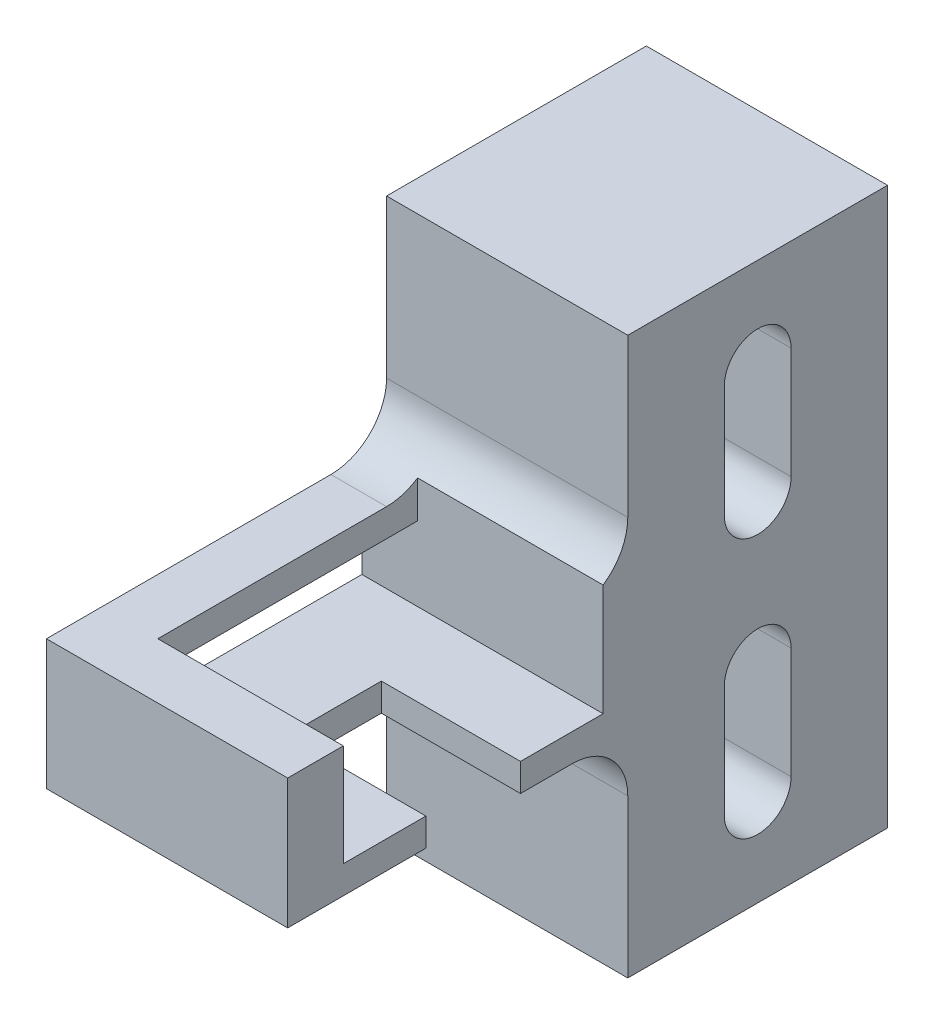
ISO-10303-21;
HEADER;
FILE_DESCRIPTION(('STEP AP214'),'2;1');
FILE_NAME('part.step','',(''),(''),'','','');
FILE_SCHEMA(('AUTOMOTIVE_DESIGN { 1 0 10303 214 1 1 1 1 }'));
ENDSEC;
DATA;
#1=APPLICATION_CONTEXT('core data for automotive mechanical design processes');
#2=APPLICATION_PROTOCOL_DEFINITION('international standard','automotive_design',2000,#1);
#3=PRODUCT_CONTEXT('',#1,'mechanical');
#4=PRODUCT('Part','Part','',(#3));
#5=PRODUCT_RELATED_PRODUCT_CATEGORY('part','',(#4));
#6=PRODUCT_DEFINITION_FORMATION('','',#4);
#7=PRODUCT_DEFINITION_CONTEXT('part definition',#1,'design');
#8=PRODUCT_DEFINITION('design','',#6,#7);
#9=PRODUCT_DEFINITION_SHAPE('','',#8);
#10=(LENGTH_UNIT() NAMED_UNIT(*) SI_UNIT(.MILLI.,.METRE.));
#11=(NAMED_UNIT(*) PLANE_ANGLE_UNIT() SI_UNIT($,.RADIAN.));
#12=(NAMED_UNIT(*) SI_UNIT($,.STERADIAN.) SOLID_ANGLE_UNIT());
#13=UNCERTAINTY_MEASURE_WITH_UNIT(LENGTH_MEASURE(1.E-05),#10,'distance_accuracy_value','');
#14=(GEOMETRIC_REPRESENTATION_CONTEXT(3) GLOBAL_UNCERTAINTY_ASSIGNED_CONTEXT((#13)) GLOBAL_UNIT_ASSIGNED_CONTEXT((#10,
#11,#12)) REPRESENTATION_CONTEXT('',''));
#15=CARTESIAN_POINT('',(0.,0.,0.));
#16=DIRECTION('',(0.,0.,1.));
#17=DIRECTION('',(1.,0.,0.));
#18=AXIS2_PLACEMENT_3D('',#15,#16,#17);
#19=CARTESIAN_POINT('',(13.,0.,14.));
#20=DIRECTION('',(-1.,0.,0.));
#21=DIRECTION('',(0.,0.,1.));
#22=AXIS2_PLACEMENT_3D('',#19,#20,#21);
#23=PLANE('',#22);
#24=DIRECTION('',(0.,0.,-1.));
#25=VECTOR('',#24,1.);
#26=CARTESIAN_POINT('',(13.,11.5,32.33));
#27=LINE('',#26,#25);
#28=CARTESIAN_POINT('',(13.,11.5,32.33));
#29=VERTEX_POINT('',#28);
#30=CARTESIAN_POINT('',(13.,11.5,24.88));
#31=VERTEX_POINT('',#30);
#32=EDGE_CURVE('E386',#29,#31,#27,.T.);
#33=ORIENTED_EDGE('',*,*,#32,.T.);
#34=DIRECTION('',(0.,1.,0.));
#35=VECTOR('',#34,1.);
#36=CARTESIAN_POINT('',(13.,0.,24.88));
#37=LINE('',#36,#35);
#38=CARTESIAN_POINT('',(13.,13.,24.88));
#39=VERTEX_POINT('',#38);
#40=EDGE_CURVE('E241',#31,#39,#37,.T.);
#41=ORIENTED_EDGE('',*,*,#40,.T.);
#42=DIRECTION('',(0.,0.,-1.));
#43=VECTOR('',#42,1.);
#44=CARTESIAN_POINT('',(13.,13.,29.33));
#45=LINE('',#44,#43);
#46=CARTESIAN_POINT('',(13.,13.,29.33));
#47=VERTEX_POINT('',#46);
#48=EDGE_CURVE('E334',#47,#39,#45,.T.);
#49=ORIENTED_EDGE('',*,*,#48,.F.);
#50=DIRECTION('',(0.,1.,0.));
#51=VECTOR('',#50,1.);
#52=CARTESIAN_POINT('',(13.,13.,29.33));
#53=LINE('',#52,#51);
#54=CARTESIAN_POINT('',(13.,18.5,29.33));
#55=VERTEX_POINT('',#54);
#56=EDGE_CURVE('E346',#47,#55,#53,.T.);
#57=ORIENTED_EDGE('',*,*,#56,.T.);
#58=DIRECTION('',(0.,0.,-1.));
#59=VECTOR('',#58,1.);
#60=CARTESIAN_POINT('',(13.,18.5,32.33));
#61=LINE('',#60,#59);
#62=CARTESIAN_POINT('',(13.,18.5,32.33));
#63=VERTEX_POINT('',#62);
#64=EDGE_CURVE('E432',#63,#55,#61,.T.);
#65=ORIENTED_EDGE('',*,*,#64,.F.);
#66=DIRECTION('',(0.,1.,0.));
#67=VECTOR('',#66,1.);
#68=CARTESIAN_POINT('',(13.,11.5,32.33));
#69=LINE('',#68,#67);
#70=EDGE_CURVE('E360',#29,#63,#69,.T.);
#71=ORIENTED_EDGE('',*,*,#70,.F.);
#72=EDGE_LOOP('',(#33,#41,#49,#57,#65,#71));
#73=FACE_BOUND('',#72,.T.);
#74=ADVANCED_FACE('F32',(#73),#23,.F.);
#75=CARTESIAN_POINT('',(0.,0.,14.));
#76=DIRECTION('',(0.,0.,-1.));
#77=DIRECTION('',(-1.,0.,0.));
#78=AXIS2_PLACEMENT_3D('',#75,#76,#77);
#79=PLANE('',#78);
#80=DIRECTION('',(0.,-1.,0.));
#81=VECTOR('',#80,1.);
#82=CARTESIAN_POINT('',(0.,0.,14.));
#83=LINE('',#82,#81);
#84=CARTESIAN_POINT('',(0.,30.,14.));
#85=VERTEX_POINT('',#84);
#86=CARTESIAN_POINT('',(0.,21.5,14.));
#87=VERTEX_POINT('',#86);
#88=EDGE_CURVE('E375',#85,#87,#83,.T.);
#89=ORIENTED_EDGE('',*,*,#88,.T.);
#90=DIRECTION('',(-1.,0.,0.));
#91=VECTOR('',#90,1.);
#92=CARTESIAN_POINT('',(13.,21.5,14.));
#93=LINE('',#92,#91);
#94=CARTESIAN_POINT('',(13.,21.5,14.));
#95=VERTEX_POINT('',#94);
#96=EDGE_CURVE('E395',#87,#95,#93,.F.);
#97=ORIENTED_EDGE('',*,*,#96,.T.);
#98=DIRECTION('',(0.,1.,0.));
#99=VECTOR('',#98,1.);
#100=CARTESIAN_POINT('',(13.,0.,14.));
#101=LINE('',#100,#99);
#102=CARTESIAN_POINT('',(13.,30.,14.));
#103=VERTEX_POINT('',#102);
#104=EDGE_CURVE('E385',#95,#103,#101,.T.);
#105=ORIENTED_EDGE('',*,*,#104,.T.);
#106=DIRECTION('',(-1.,0.,0.));
#107=VECTOR('',#106,1.);
#108=CARTESIAN_POINT('',(0.,30.,14.));
#109=LINE('',#108,#107);
#110=EDGE_CURVE('E384',#103,#85,#109,.T.);
#111=ORIENTED_EDGE('',*,*,#110,.T.);
#112=EDGE_LOOP('',(#89,#97,#105,#111));
#113=FACE_BOUND('',#112,.T.);
#114=ADVANCED_FACE('F453',(#113),#79,.F.);
#115=CARTESIAN_POINT('',(13.,0.,14.));
#116=VERTEX_POINT('',#115);
#117=CARTESIAN_POINT('',(13.,8.5,14.));
#118=VERTEX_POINT('',#117);
#119=EDGE_CURVE('E381',#116,#118,#101,.T.);
#120=ORIENTED_EDGE('',*,*,#119,.T.);
#121=DIRECTION('',(1.,0.,0.));
#122=VECTOR('',#121,1.);
#123=CARTESIAN_POINT('',(0.,8.5,14.));
#124=LINE('',#123,#122);
#125=CARTESIAN_POINT('',(0.,8.5,14.));
#126=VERTEX_POINT('',#125);
#127=EDGE_CURVE('E474',#118,#126,#124,.F.);
#128=ORIENTED_EDGE('',*,*,#127,.T.);
#129=CARTESIAN_POINT('',(0.,0.,14.));
#130=VERTEX_POINT('',#129);
#131=EDGE_CURVE('E371',#126,#130,#83,.T.);
#132=ORIENTED_EDGE('',*,*,#131,.T.);
#133=DIRECTION('',(1.,0.,0.));
#134=VECTOR('',#133,1.);
#135=CARTESIAN_POINT('',(0.,0.,14.));
#136=LINE('',#135,#134);
#137=EDGE_CURVE('E367',#130,#116,#136,.T.);
#138=ORIENTED_EDGE('',*,*,#137,.T.);
#139=EDGE_LOOP('',(#120,#128,#132,#138));
#140=FACE_BOUND('',#139,.T.);
#141=ADVANCED_FACE('F510',(#140),#79,.F.);
#142=CARTESIAN_POINT('',(0.,0.,14.));
#143=DIRECTION('',(1.,0.,0.));
#144=DIRECTION('',(0.,0.,-1.));
#145=AXIS2_PLACEMENT_3D('',#142,#143,#144);
#146=PLANE('',#145);
#147=DIRECTION('',(0.,1.,0.));
#148=VECTOR('',#147,1.);
#149=CARTESIAN_POINT('',(0.,19.,8.8));
#150=LINE('',#149,#148);
#151=CARTESIAN_POINT('',(0.,19.,8.8));
#152=VERTEX_POINT('',#151);
#153=CARTESIAN_POINT('',(0.,25.,8.8));
#154=VERTEX_POINT('',#153);
#155=EDGE_CURVE('E267',#152,#154,#150,.T.);
#156=ORIENTED_EDGE('',*,*,#155,.F.);
#157=CARTESIAN_POINT('',(0.,19.,7.));
#158=DIRECTION('',(-1.,0.,0.));
#159=DIRECTION('',(0.,0.,1.));
#160=AXIS2_PLACEMENT_3D('',#157,#158,#159);
#161=CIRCLE('',#160,1.8);
#162=CARTESIAN_POINT('',(0.,19.,5.2));
#163=VERTEX_POINT('',#162);
#164=EDGE_CURVE('E57',#163,#152,#161,.T.);
#165=ORIENTED_EDGE('',*,*,#164,.F.);
#166=DIRECTION('',(0.,-1.,0.));
#167=VECTOR('',#166,1.);
#168=CARTESIAN_POINT('',(0.,19.,5.2));
#169=LINE('',#168,#167);
#170=CARTESIAN_POINT('',(0.,25.,5.2));
#171=VERTEX_POINT('',#170);
#172=EDGE_CURVE('E256',#171,#163,#169,.T.);
#173=ORIENTED_EDGE('',*,*,#172,.F.);
#174=CARTESIAN_POINT('',(0.,25.,7.));
#175=DIRECTION('',(-1.,0.,0.));
#176=DIRECTION('',(0.,0.,1.));
#177=AXIS2_PLACEMENT_3D('',#174,#175,#176);
#178=CIRCLE('',#177,1.8);
#179=EDGE_CURVE('E270',#154,#171,#178,.T.);
#180=ORIENTED_EDGE('',*,*,#179,.F.);
#181=EDGE_LOOP('',(#156,#165,#173,#180));
#182=FACE_BOUND('',#181,.T.);
#183=DIRECTION('',(0.,1.,0.));
#184=VECTOR('',#183,1.);
#185=CARTESIAN_POINT('',(0.,5.,8.8));
#186=LINE('',#185,#184);
#187=CARTESIAN_POINT('',(0.,5.,8.8));
#188=VERTEX_POINT('',#187);
#189=CARTESIAN_POINT('',(0.,11.,8.8));
#190=VERTEX_POINT('',#189);
#191=EDGE_CURVE('E298',#188,#190,#186,.T.);
#192=ORIENTED_EDGE('',*,*,#191,.F.);
#193=CARTESIAN_POINT('',(0.,5.,7.));
#194=DIRECTION('',(-1.,0.,0.));
#195=DIRECTION('',(0.,0.,1.));
#196=AXIS2_PLACEMENT_3D('',#193,#194,#195);
#197=CIRCLE('',#196,1.8);
#198=CARTESIAN_POINT('',(0.,5.,5.2));
#199=VERTEX_POINT('',#198);
#200=EDGE_CURVE('E277',#199,#188,#197,.T.);
#201=ORIENTED_EDGE('',*,*,#200,.F.);
#202=DIRECTION('',(0.,-1.,0.));
#203=VECTOR('',#202,1.);
#204=CARTESIAN_POINT('',(0.,5.,5.2));
#205=LINE('',#204,#203);
#206=CARTESIAN_POINT('',(0.,11.,5.2));
#207=VERTEX_POINT('',#206);
#208=EDGE_CURVE('E287',#207,#199,#205,.T.);
#209=ORIENTED_EDGE('',*,*,#208,.F.);
#210=CARTESIAN_POINT('',(0.,11.,7.));
#211=DIRECTION('',(-1.,0.,0.));
#212=DIRECTION('',(0.,0.,1.));
#213=AXIS2_PLACEMENT_3D('',#210,#211,#212);
#214=CIRCLE('',#213,1.8);
#215=EDGE_CURVE('E301',#190,#207,#214,.T.);
#216=ORIENTED_EDGE('',*,*,#215,.F.);
#217=EDGE_LOOP('',(#192,#201,#209,#216));
#218=FACE_BOUND('',#217,.T.);
#219=DIRECTION('',(0.,0.,1.));
#220=VECTOR('',#219,1.);
#221=CARTESIAN_POINT('',(0.,17.,14.));
#222=LINE('',#221,#220);
#223=CARTESIAN_POINT('',(0.,17.,15.33));
#224=VERTEX_POINT('',#223);
#225=CARTESIAN_POINT('',(0.,17.,29.33));
#226=VERTEX_POINT('',#225);
#227=EDGE_CURVE('E327',#224,#226,#222,.T.);
#228=ORIENTED_EDGE('',*,*,#227,.T.);
#229=DIRECTION('',(0.,-1.,0.));
#230=VECTOR('',#229,1.);
#231=CARTESIAN_POINT('',(0.,0.,29.33));
#232=LINE('',#231,#230);
#233=CARTESIAN_POINT('',(0.,13.,29.33));
#234=VERTEX_POINT('',#233);
#235=EDGE_CURVE('E330',#226,#234,#232,.T.);
#236=ORIENTED_EDGE('',*,*,#235,.T.);
#237=DIRECTION('',(0.,0.,-1.));
#238=VECTOR('',#237,1.);
#239=CARTESIAN_POINT('',(0.,13.,14.));
#240=LINE('',#239,#238);
#241=CARTESIAN_POINT('',(0.,13.,15.33));
#242=VERTEX_POINT('',#241);
#243=EDGE_CURVE('E320',#234,#242,#240,.T.);
#244=ORIENTED_EDGE('',*,*,#243,.T.);
#245=DIRECTION('',(0.,1.,0.));
#246=VECTOR('',#245,1.);
#247=CARTESIAN_POINT('',(0.,0.,15.33));
#248=LINE('',#247,#246);
#249=EDGE_CURVE('E324',#242,#224,#248,.T.);
#250=ORIENTED_EDGE('',*,*,#249,.T.);
#251=EDGE_LOOP('',(#228,#236,#244,#250));
#252=FACE_BOUND('',#251,.T.);
#253=DIRECTION('',(0.,-1.,0.));
#254=VECTOR('',#253,1.);
#255=CARTESIAN_POINT('',(0.,0.,0.));
#256=LINE('',#255,#254);
#257=CARTESIAN_POINT('',(0.,30.,0.));
#258=VERTEX_POINT('',#257);
#259=CARTESIAN_POINT('',(0.,0.,0.));
#260=VERTEX_POINT('',#259);
#261=EDGE_CURVE('E498',#258,#260,#256,.T.);
#262=ORIENTED_EDGE('',*,*,#261,.T.);
#263=DIRECTION('',(0.,0.,-1.));
#264=VECTOR('',#263,1.);
#265=CARTESIAN_POINT('',(0.,0.,14.));
#266=LINE('',#265,#264);
#267=EDGE_CURVE('E379',#130,#260,#266,.T.);
#268=ORIENTED_EDGE('',*,*,#267,.F.);
#269=ORIENTED_EDGE('',*,*,#131,.F.);
#270=CARTESIAN_POINT('',(0.,8.5,17.));
#271=DIRECTION('',(1.,0.,0.));
#272=DIRECTION('',(0.,0.,-1.));
#273=AXIS2_PLACEMENT_3D('',#270,#271,#272);
#274=CIRCLE('',#273,3.);
#275=CARTESIAN_POINT('',(0.,11.5,17.));
#276=VERTEX_POINT('',#275);
#277=EDGE_CURVE('E399',#126,#276,#274,.T.);
#278=ORIENTED_EDGE('',*,*,#277,.T.);
#279=DIRECTION('',(0.,0.,-1.));
#280=VECTOR('',#279,1.);
#281=CARTESIAN_POINT('',(0.,11.5,32.33));
#282=LINE('',#281,#280);
#283=CARTESIAN_POINT('',(0.,11.5,32.33));
#284=VERTEX_POINT('',#283);
#285=EDGE_CURVE('E499',#284,#276,#282,.T.);
#286=ORIENTED_EDGE('',*,*,#285,.F.);
#287=DIRECTION('',(0.,-1.,0.));
#288=VECTOR('',#287,1.);
#289=CARTESIAN_POINT('',(0.,11.5,32.33));
#290=LINE('',#289,#288);
#291=CARTESIAN_POINT('',(0.,18.5,32.33));
#292=VERTEX_POINT('',#291);
#293=EDGE_CURVE('E349',#292,#284,#290,.T.);
#294=ORIENTED_EDGE('',*,*,#293,.F.);
#295=DIRECTION('',(0.,0.,-1.));
#296=VECTOR('',#295,1.);
#297=CARTESIAN_POINT('',(0.,18.5,32.33));
#298=LINE('',#297,#296);
#299=CARTESIAN_POINT('',(0.,18.5,17.));
#300=VERTEX_POINT('',#299);
#301=EDGE_CURVE('E364',#292,#300,#298,.T.);
#302=ORIENTED_EDGE('',*,*,#301,.T.);
#303=CARTESIAN_POINT('',(0.,21.5,17.));
#304=DIRECTION('',(1.,0.,0.));
#305=DIRECTION('',(0.,0.,-1.));
#306=AXIS2_PLACEMENT_3D('',#303,#304,#305);
#307=CIRCLE('',#306,3.);
#308=EDGE_CURVE('E401',#300,#87,#307,.T.);
#309=ORIENTED_EDGE('',*,*,#308,.T.);
#310=ORIENTED_EDGE('',*,*,#88,.F.);
#311=DIRECTION('',(0.,0.,-1.));
#312=VECTOR('',#311,1.);
#313=CARTESIAN_POINT('',(0.,30.,14.));
#314=LINE('',#313,#312);
#315=EDGE_CURVE('E459',#85,#258,#314,.T.);
#316=ORIENTED_EDGE('',*,*,#315,.T.);
#317=EDGE_LOOP('',(#262,#268,#269,#278,#286,#294,#302,#309,#310,#316));
#318=FACE_BOUND('',#317,.T.);
#319=ADVANCED_FACE('F444',(#182,#218,#252,#318),#146,.F.);
#320=CARTESIAN_POINT('',(0.,0.,14.));
#321=DIRECTION('',(0.,1.,0.));
#322=DIRECTION('',(0.,0.,1.));
#323=AXIS2_PLACEMENT_3D('',#320,#321,#322);
#324=PLANE('',#323);
#325=DIRECTION('',(1.,0.,0.));
#326=VECTOR('',#325,1.);
#327=CARTESIAN_POINT('',(0.,0.,0.));
#328=LINE('',#327,#326);
#329=CARTESIAN_POINT('',(13.,0.,0.));
#330=VERTEX_POINT('',#329);
#331=EDGE_CURVE('E497',#260,#330,#328,.T.);
#332=ORIENTED_EDGE('',*,*,#331,.T.);
#333=DIRECTION('',(0.,0.,-1.));
#334=VECTOR('',#333,1.);
#335=CARTESIAN_POINT('',(13.,0.,14.));
#336=LINE('',#335,#334);
#337=EDGE_CURVE('E480',#116,#330,#336,.T.);
#338=ORIENTED_EDGE('',*,*,#337,.F.);
#339=ORIENTED_EDGE('',*,*,#137,.F.);
#340=ORIENTED_EDGE('',*,*,#267,.T.);
#341=EDGE_LOOP('',(#332,#338,#339,#340));
#342=FACE_BOUND('',#341,.T.);
#343=ADVANCED_FACE('F511',(#342),#324,.F.);
#344=DIRECTION('',(0.,-1.,0.));
#345=VECTOR('',#344,1.);
#346=CARTESIAN_POINT('',(13.,19.,5.2));
#347=LINE('',#346,#345);
#348=CARTESIAN_POINT('',(13.,25.,5.2));
#349=VERTEX_POINT('',#348);
#350=CARTESIAN_POINT('',(13.,19.,5.2));
#351=VERTEX_POINT('',#350);
#352=EDGE_CURVE('E262',#349,#351,#347,.T.);
#353=ORIENTED_EDGE('',*,*,#352,.T.);
#354=CARTESIAN_POINT('',(13.,19.,7.));
#355=DIRECTION('',(-1.,0.,0.));
#356=DIRECTION('',(0.,0.,1.));
#357=AXIS2_PLACEMENT_3D('',#354,#355,#356);
#358=CIRCLE('',#357,1.8);
#359=CARTESIAN_POINT('',(13.,19.,8.8));
#360=VERTEX_POINT('',#359);
#361=EDGE_CURVE('E252',#351,#360,#358,.T.);
#362=ORIENTED_EDGE('',*,*,#361,.T.);
#363=DIRECTION('',(0.,1.,0.));
#364=VECTOR('',#363,1.);
#365=CARTESIAN_POINT('',(13.,19.,8.8));
#366=LINE('',#365,#364);
#367=CARTESIAN_POINT('',(13.,25.,8.8));
#368=VERTEX_POINT('',#367);
#369=EDGE_CURVE('E255',#360,#368,#366,.T.);
#370=ORIENTED_EDGE('',*,*,#369,.T.);
#371=CARTESIAN_POINT('',(13.,25.,7.));
#372=DIRECTION('',(-1.,0.,0.));
#373=DIRECTION('',(0.,0.,1.));
#374=AXIS2_PLACEMENT_3D('',#371,#372,#373);
#375=CIRCLE('',#374,1.8);
#376=EDGE_CURVE('E259',#368,#349,#375,.T.);
#377=ORIENTED_EDGE('',*,*,#376,.T.);
#378=EDGE_LOOP('',(#353,#362,#370,#377));
#379=FACE_BOUND('',#378,.T.);
#380=DIRECTION('',(0.,-1.,0.));
#381=VECTOR('',#380,1.);
#382=CARTESIAN_POINT('',(13.,5.,5.2));
#383=LINE('',#382,#381);
#384=CARTESIAN_POINT('',(13.,11.,5.2));
#385=VERTEX_POINT('',#384);
#386=CARTESIAN_POINT('',(13.,5.,5.2));
#387=VERTEX_POINT('',#386);
#388=EDGE_CURVE('E293',#385,#387,#383,.T.);
#389=ORIENTED_EDGE('',*,*,#388,.T.);
#390=CARTESIAN_POINT('',(13.,5.,7.));
#391=DIRECTION('',(-1.,0.,0.));
#392=DIRECTION('',(0.,0.,1.));
#393=AXIS2_PLACEMENT_3D('',#390,#391,#392);
#394=CIRCLE('',#393,1.8);
#395=CARTESIAN_POINT('',(13.,5.,8.8));
#396=VERTEX_POINT('',#395);
#397=EDGE_CURVE('E283',#387,#396,#394,.T.);
#398=ORIENTED_EDGE('',*,*,#397,.T.);
#399=DIRECTION('',(0.,1.,0.));
#400=VECTOR('',#399,1.);
#401=CARTESIAN_POINT('',(13.,5.,8.8));
#402=LINE('',#401,#400);
#403=CARTESIAN_POINT('',(13.,11.,8.8));
#404=VERTEX_POINT('',#403);
#405=EDGE_CURVE('E286',#396,#404,#402,.T.);
#406=ORIENTED_EDGE('',*,*,#405,.T.);
#407=CARTESIAN_POINT('',(13.,11.,7.));
#408=DIRECTION('',(-1.,0.,0.));
#409=DIRECTION('',(0.,0.,1.));
#410=AXIS2_PLACEMENT_3D('',#407,#408,#409);
#411=CIRCLE('',#410,1.8);
#412=EDGE_CURVE('E290',#404,#385,#411,.T.);
#413=ORIENTED_EDGE('',*,*,#412,.T.);
#414=EDGE_LOOP('',(#389,#398,#406,#413));
#415=FACE_BOUND('',#414,.T.);
#416=CARTESIAN_POINT('',(13.,13.,19.78));
#417=VERTEX_POINT('',#416);
#418=CARTESIAN_POINT('',(13.,13.,15.33));
#419=VERTEX_POINT('',#418);
#420=EDGE_CURVE('E337',#417,#419,#45,.T.);
#421=ORIENTED_EDGE('',*,*,#420,.F.);
#422=DIRECTION('',(0.,1.,0.));
#423=VECTOR('',#422,1.);
#424=CARTESIAN_POINT('',(13.,0.,19.78));
#425=LINE('',#424,#423);
#426=CARTESIAN_POINT('',(13.,11.5,19.78));
#427=VERTEX_POINT('',#426);
#428=EDGE_CURVE('E49',#427,#417,#425,.T.);
#429=ORIENTED_EDGE('',*,*,#428,.F.);
#430=CARTESIAN_POINT('',(13.,11.5,17.));
#431=VERTEX_POINT('',#430);
#432=EDGE_CURVE('E36',#427,#431,#27,.T.);
#433=ORIENTED_EDGE('',*,*,#432,.T.);
#434=CARTESIAN_POINT('',(13.,8.5,17.));
#435=DIRECTION('',(-1.,0.,0.));
#436=DIRECTION('',(0.,0.,1.));
#437=AXIS2_PLACEMENT_3D('',#434,#435,#436);
#438=CIRCLE('',#437,3.);
#439=EDGE_CURVE('E397',#431,#118,#438,.T.);
#440=ORIENTED_EDGE('',*,*,#439,.T.);
#441=ORIENTED_EDGE('',*,*,#119,.F.);
#442=ORIENTED_EDGE('',*,*,#337,.T.);
#443=DIRECTION('',(0.,1.,0.));
#444=VECTOR('',#443,1.);
#445=CARTESIAN_POINT('',(13.,0.,0.));
#446=LINE('',#445,#444);
#447=CARTESIAN_POINT('',(13.,30.,0.));
#448=VERTEX_POINT('',#447);
#449=EDGE_CURVE('E495',#330,#448,#446,.T.);
#450=ORIENTED_EDGE('',*,*,#449,.T.);
#451=DIRECTION('',(0.,0.,-1.));
#452=VECTOR('',#451,1.);
#453=CARTESIAN_POINT('',(13.,30.,14.));
#454=LINE('',#453,#452);
#455=EDGE_CURVE('E485',#103,#448,#454,.T.);
#456=ORIENTED_EDGE('',*,*,#455,.F.);
#457=ORIENTED_EDGE('',*,*,#104,.F.);
#458=CARTESIAN_POINT('',(13.,21.5,17.));
#459=DIRECTION('',(-1.,0.,0.));
#460=DIRECTION('',(0.,0.,1.));
#461=AXIS2_PLACEMENT_3D('',#458,#459,#460);
#462=CIRCLE('',#461,3.);
#463=CARTESIAN_POINT('',(13.,19.0077921435001,15.33));
#464=VERTEX_POINT('',#463);
#465=EDGE_CURVE('E403',#95,#464,#462,.T.);
#466=ORIENTED_EDGE('',*,*,#465,.T.);
#467=DIRECTION('',(0.,1.,0.));
#468=VECTOR('',#467,1.);
#469=CARTESIAN_POINT('',(13.,13.,15.33));
#470=LINE('',#469,#468);
#471=EDGE_CURVE('E342',#419,#464,#470,.T.);
#472=ORIENTED_EDGE('',*,*,#471,.F.);
#473=EDGE_LOOP('',(#421,#429,#433,#440,#441,#442,#450,#456,#457,#466,#472));
#474=FACE_BOUND('',#473,.T.);
#475=ADVANCED_FACE('F448',(#379,#415,#474),#23,.F.);
#476=CARTESIAN_POINT('',(0.,30.,14.));
#477=DIRECTION('',(0.,-1.,0.));
#478=DIRECTION('',(0.,0.,-1.));
#479=AXIS2_PLACEMENT_3D('',#476,#477,#478);
#480=PLANE('',#479);
#481=DIRECTION('',(-1.,0.,0.));
#482=VECTOR('',#481,1.);
#483=CARTESIAN_POINT('',(0.,30.,0.));
#484=LINE('',#483,#482);
#485=EDGE_CURVE('E493',#448,#258,#484,.T.);
#486=ORIENTED_EDGE('',*,*,#485,.T.);
#487=ORIENTED_EDGE('',*,*,#315,.F.);
#488=ORIENTED_EDGE('',*,*,#110,.F.);
#489=ORIENTED_EDGE('',*,*,#455,.T.);
#490=EDGE_LOOP('',(#486,#487,#488,#489));
#491=FACE_BOUND('',#490,.T.);
#492=ADVANCED_FACE('F516',(#491),#480,.F.);
#493=CARTESIAN_POINT('',(0.,0.,0.));
#494=DIRECTION('',(0.,0.,-1.));
#495=DIRECTION('',(-1.,0.,0.));
#496=AXIS2_PLACEMENT_3D('',#493,#494,#495);
#497=PLANE('',#496);
#498=ORIENTED_EDGE('',*,*,#261,.F.);
#499=ORIENTED_EDGE('',*,*,#485,.F.);
#500=ORIENTED_EDGE('',*,*,#449,.F.);
#501=ORIENTED_EDGE('',*,*,#331,.F.);
#502=EDGE_LOOP('',(#498,#499,#500,#501));
#503=FACE_BOUND('',#502,.T.);
#504=ADVANCED_FACE('F513',(#503),#497,.T.);
#505=CARTESIAN_POINT('',(0.,11.5,32.33));
#506=DIRECTION('',(0.,1.,0.));
#507=DIRECTION('',(0.,0.,1.));
#508=AXIS2_PLACEMENT_3D('',#505,#506,#507);
#509=PLANE('',#508);
#510=DIRECTION('',(0.,0.,1.));
#511=VECTOR('',#510,1.);
#512=CARTESIAN_POINT('',(5.5,11.5,32.33));
#513=LINE('',#512,#511);
#514=CARTESIAN_POINT('',(5.5,11.5,19.78));
#515=VERTEX_POINT('',#514);
#516=CARTESIAN_POINT('',(5.5,11.5,24.88));
#517=VERTEX_POINT('',#516);
#518=EDGE_CURVE('E226',#515,#517,#513,.T.);
#519=ORIENTED_EDGE('',*,*,#518,.T.);
#520=DIRECTION('',(1.,0.,0.));
#521=VECTOR('',#520,1.);
#522=CARTESIAN_POINT('',(0.,11.5,24.88));
#523=LINE('',#522,#521);
#524=EDGE_CURVE('E249',#517,#31,#523,.T.);
#525=ORIENTED_EDGE('',*,*,#524,.T.);
#526=ORIENTED_EDGE('',*,*,#32,.F.);
#527=DIRECTION('',(1.,0.,0.));
#528=VECTOR('',#527,1.);
#529=CARTESIAN_POINT('',(0.,11.5,32.33));
#530=LINE('',#529,#528);
#531=EDGE_CURVE('E358',#284,#29,#530,.T.);
#532=ORIENTED_EDGE('',*,*,#531,.F.);
#533=ORIENTED_EDGE('',*,*,#285,.T.);
#534=DIRECTION('',(1.,0.,0.));
#535=VECTOR('',#534,1.);
#536=CARTESIAN_POINT('',(13.,11.5,17.));
#537=LINE('',#536,#535);
#538=EDGE_CURVE('E472',#276,#431,#537,.T.);
#539=ORIENTED_EDGE('',*,*,#538,.T.);
#540=ORIENTED_EDGE('',*,*,#432,.F.);
#541=DIRECTION('',(-1.,0.,0.));
#542=VECTOR('',#541,1.);
#543=CARTESIAN_POINT('',(0.,11.5,19.78));
#544=LINE('',#543,#542);
#545=EDGE_CURVE('E244',#427,#515,#544,.T.);
#546=ORIENTED_EDGE('',*,*,#545,.T.);
#547=EDGE_LOOP('',(#519,#525,#526,#532,#533,#539,#540,#546));
#548=FACE_BOUND('',#547,.T.);
#549=ADVANCED_FACE('F523',(#548),#509,.F.);
#550=CARTESIAN_POINT('',(0.,18.5,32.33));
#551=DIRECTION('',(0.,-1.,0.));
#552=DIRECTION('',(1.,0.,0.));
#553=AXIS2_PLACEMENT_3D('',#550,#551,#552);
#554=PLANE('',#553);
#555=DIRECTION('',(0.,0.,1.));
#556=VECTOR('',#555,1.);
#557=CARTESIAN_POINT('',(3.,18.5,29.33));
#558=LINE('',#557,#556);
#559=CARTESIAN_POINT('',(3.,18.5,17.));
#560=VERTEX_POINT('',#559);
#561=CARTESIAN_POINT('',(3.,18.5,29.33));
#562=VERTEX_POINT('',#561);
#563=EDGE_CURVE('E333',#560,#562,#558,.T.);
#564=ORIENTED_EDGE('',*,*,#563,.F.);
#565=DIRECTION('',(-1.,0.,0.));
#566=VECTOR('',#565,1.);
#567=CARTESIAN_POINT('',(0.,18.5,17.));
#568=LINE('',#567,#566);
#569=EDGE_CURVE('E394',#560,#300,#568,.T.);
#570=ORIENTED_EDGE('',*,*,#569,.T.);
#571=ORIENTED_EDGE('',*,*,#301,.F.);
#572=DIRECTION('',(-1.,0.,0.));
#573=VECTOR('',#572,1.);
#574=CARTESIAN_POINT('',(0.,18.5,32.33));
#575=LINE('',#574,#573);
#576=EDGE_CURVE('E362',#63,#292,#575,.T.);
#577=ORIENTED_EDGE('',*,*,#576,.F.);
#578=ORIENTED_EDGE('',*,*,#64,.T.);
#579=DIRECTION('',(1.,0.,0.));
#580=VECTOR('',#579,1.);
#581=CARTESIAN_POINT('',(13.,18.5,29.33));
#582=LINE('',#581,#580);
#583=EDGE_CURVE('E344',#562,#55,#582,.T.);
#584=ORIENTED_EDGE('',*,*,#583,.F.);
#585=EDGE_LOOP('',(#564,#570,#571,#577,#578,#584));
#586=FACE_BOUND('',#585,.T.);
#587=ADVANCED_FACE('F426',(#586),#554,.F.);
#588=CARTESIAN_POINT('',(0.,0.,32.33));
#589=DIRECTION('',(0.,0.,-1.));
#590=DIRECTION('',(-1.,0.,0.));
#591=AXIS2_PLACEMENT_3D('',#588,#589,#590);
#592=PLANE('',#591);
#593=ORIENTED_EDGE('',*,*,#293,.T.);
#594=ORIENTED_EDGE('',*,*,#531,.T.);
#595=ORIENTED_EDGE('',*,*,#70,.T.);
#596=ORIENTED_EDGE('',*,*,#576,.T.);
#597=EDGE_LOOP('',(#593,#594,#595,#596));
#598=FACE_BOUND('',#597,.T.);
#599=ADVANCED_FACE('F553',(#598),#592,.F.);
#600=CARTESIAN_POINT('',(13.,13.,29.33));
#601=DIRECTION('',(0.,0.,1.));
#602=DIRECTION('',(1.,0.,0.));
#603=AXIS2_PLACEMENT_3D('',#600,#601,#602);
#604=PLANE('',#603);
#605=ORIENTED_EDGE('',*,*,#583,.T.);
#606=ORIENTED_EDGE('',*,*,#56,.F.);
#607=DIRECTION('',(1.,0.,0.));
#608=VECTOR('',#607,1.);
#609=CARTESIAN_POINT('',(13.,13.,29.33));
#610=LINE('',#609,#608);
#611=EDGE_CURVE('E339',#234,#47,#610,.T.);
#612=ORIENTED_EDGE('',*,*,#611,.F.);
#613=ORIENTED_EDGE('',*,*,#235,.F.);
#614=DIRECTION('',(1.,0.,0.));
#615=VECTOR('',#614,1.);
#616=CARTESIAN_POINT('',(-5.00000000044735E-05,17.,29.33));
#617=LINE('',#616,#615);
#618=CARTESIAN_POINT('',(3.,17.,29.33));
#619=VERTEX_POINT('',#618);
#620=EDGE_CURVE('E318',#226,#619,#617,.T.);
#621=ORIENTED_EDGE('',*,*,#620,.T.);
#622=DIRECTION('',(0.,1.,0.));
#623=VECTOR('',#622,1.);
#624=CARTESIAN_POINT('',(3.,13.,29.33));
#625=LINE('',#624,#623);
#626=EDGE_CURVE('E350',#619,#562,#625,.T.);
#627=ORIENTED_EDGE('',*,*,#626,.T.);
#628=EDGE_LOOP('',(#605,#606,#612,#613,#621,#627));
#629=FACE_BOUND('',#628,.T.);
#630=ADVANCED_FACE('F434',(#629),#604,.F.);
#631=CARTESIAN_POINT('',(3.,13.,29.33));
#632=DIRECTION('',(-1.,0.,0.));
#633=DIRECTION('',(0.,-1.,0.));
#634=AXIS2_PLACEMENT_3D('',#631,#632,#633);
#635=PLANE('',#634);
#636=ORIENTED_EDGE('',*,*,#626,.F.);
#637=DIRECTION('',(0.,0.,1.));
#638=VECTOR('',#637,1.);
#639=CARTESIAN_POINT('',(3.,17.,29.33));
#640=LINE('',#639,#638);
#641=CARTESIAN_POINT('',(3.,17.,15.33));
#642=VERTEX_POINT('',#641);
#643=EDGE_CURVE('E308',#642,#619,#640,.T.);
#644=ORIENTED_EDGE('',*,*,#643,.F.);
#645=DIRECTION('',(0.,1.,0.));
#646=VECTOR('',#645,1.);
#647=CARTESIAN_POINT('',(3.,13.,15.33));
#648=LINE('',#647,#646);
#649=CARTESIAN_POINT('',(3.,19.0077921435001,15.33));
#650=VERTEX_POINT('',#649);
#651=EDGE_CURVE('E353',#642,#650,#648,.T.);
#652=ORIENTED_EDGE('',*,*,#651,.T.);
#653=CARTESIAN_POINT('',(3.,21.5,17.));
#654=DIRECTION('',(-1.,0.,0.));
#655=DIRECTION('',(0.,-1.,0.));
#656=AXIS2_PLACEMENT_3D('',#653,#654,#655);
#657=CIRCLE('',#656,3.);
#658=EDGE_CURVE('E11',#650,#560,#657,.T.);
#659=ORIENTED_EDGE('',*,*,#658,.T.);
#660=ORIENTED_EDGE('',*,*,#563,.T.);
#661=EDGE_LOOP('',(#636,#644,#652,#659,#660));
#662=FACE_BOUND('',#661,.T.);
#663=ADVANCED_FACE('F422',(#662),#635,.F.);
#664=CARTESIAN_POINT('',(13.,13.,15.33));
#665=DIRECTION('',(0.,0.,-1.));
#666=DIRECTION('',(-1.,0.,0.));
#667=AXIS2_PLACEMENT_3D('',#664,#665,#666);
#668=PLANE('',#667);
#669=ORIENTED_EDGE('',*,*,#471,.T.);
#670=DIRECTION('',(1.,0.,0.));
#671=VECTOR('',#670,1.);
#672=CARTESIAN_POINT('',(13.,19.0077921435001,15.33));
#673=LINE('',#672,#671);
#674=EDGE_CURVE('E42',#464,#650,#673,.F.);
#675=ORIENTED_EDGE('',*,*,#674,.T.);
#676=ORIENTED_EDGE('',*,*,#651,.F.);
#677=DIRECTION('',(1.,0.,0.));
#678=VECTOR('',#677,1.);
#679=CARTESIAN_POINT('',(-5.00000000044735E-05,17.,15.33));
#680=LINE('',#679,#678);
#681=EDGE_CURVE('E317',#224,#642,#680,.T.);
#682=ORIENTED_EDGE('',*,*,#681,.F.);
#683=ORIENTED_EDGE('',*,*,#249,.F.);
#684=DIRECTION('',(-1.,0.,0.));
#685=VECTOR('',#684,1.);
#686=CARTESIAN_POINT('',(13.,13.,15.33));
#687=LINE('',#686,#685);
#688=EDGE_CURVE('E336',#419,#242,#687,.T.);
#689=ORIENTED_EDGE('',*,*,#688,.F.);
#690=EDGE_LOOP('',(#669,#675,#676,#682,#683,#689));
#691=FACE_BOUND('',#690,.T.);
#692=ADVANCED_FACE('F411',(#691),#668,.F.);
#693=CARTESIAN_POINT('',(0.,13.,0.));
#694=DIRECTION('',(0.,1.,0.));
#695=DIRECTION('',(-1.,0.,0.));
#696=AXIS2_PLACEMENT_3D('',#693,#694,#695);
#697=PLANE('',#696);
#698=DIRECTION('',(1.,0.,0.));
#699=VECTOR('',#698,1.);
#700=CARTESIAN_POINT('',(13.,13.,24.88));
#701=LINE('',#700,#699);
#702=CARTESIAN_POINT('',(5.5,13.,24.88));
#703=VERTEX_POINT('',#702);
#704=EDGE_CURVE('E237',#703,#39,#701,.T.);
#705=ORIENTED_EDGE('',*,*,#704,.F.);
#706=DIRECTION('',(0.,0.,1.));
#707=VECTOR('',#706,1.);
#708=CARTESIAN_POINT('',(5.5,13.,19.78));
#709=LINE('',#708,#707);
#710=CARTESIAN_POINT('',(5.5,13.,19.78));
#711=VERTEX_POINT('',#710);
#712=EDGE_CURVE('E223',#711,#703,#709,.T.);
#713=ORIENTED_EDGE('',*,*,#712,.F.);
#714=DIRECTION('',(-1.,0.,0.));
#715=VECTOR('',#714,1.);
#716=CARTESIAN_POINT('',(13.,13.,19.78));
#717=LINE('',#716,#715);
#718=EDGE_CURVE('E230',#417,#711,#717,.T.);
#719=ORIENTED_EDGE('',*,*,#718,.F.);
#720=ORIENTED_EDGE('',*,*,#420,.T.);
#721=ORIENTED_EDGE('',*,*,#688,.T.);
#722=ORIENTED_EDGE('',*,*,#243,.F.);
#723=ORIENTED_EDGE('',*,*,#611,.T.);
#724=ORIENTED_EDGE('',*,*,#48,.T.);
#725=EDGE_LOOP('',(#705,#713,#719,#720,#721,#722,#723,#724));
#726=FACE_BOUND('',#725,.T.);
#727=ADVANCED_FACE('F235',(#726),#697,.T.);
#728=CARTESIAN_POINT('',(-5.00000000044735E-05,17.,29.33));
#729=DIRECTION('',(0.,1.,0.));
#730=DIRECTION('',(-1.,0.,0.));
#731=AXIS2_PLACEMENT_3D('',#728,#729,#730);
#732=PLANE('',#731);
#733=ORIENTED_EDGE('',*,*,#681,.T.);
#734=ORIENTED_EDGE('',*,*,#643,.T.);
#735=ORIENTED_EDGE('',*,*,#620,.F.);
#736=ORIENTED_EDGE('',*,*,#227,.F.);
#737=EDGE_LOOP('',(#733,#734,#735,#736));
#738=FACE_BOUND('',#737,.T.);
#739=ADVANCED_FACE('F443',(#738),#732,.F.);
#740=CARTESIAN_POINT('',(0.,8.5,17.));
#741=DIRECTION('',(-1.,0.,0.));
#742=DIRECTION('',(0.,0.,1.));
#743=AXIS2_PLACEMENT_3D('',#740,#741,#742);
#744=CYLINDRICAL_SURFACE('',#743,3.);
#745=ORIENTED_EDGE('',*,*,#277,.F.);
#746=ORIENTED_EDGE('',*,*,#127,.F.);
#747=ORIENTED_EDGE('',*,*,#439,.F.);
#748=ORIENTED_EDGE('',*,*,#538,.F.);
#749=EDGE_LOOP('',(#745,#746,#747,#748));
#750=FACE_BOUND('',#749,.T.);
#751=ADVANCED_FACE('F507',(#750),#744,.F.);
#752=CARTESIAN_POINT('',(0.,21.5,17.));
#753=DIRECTION('',(1.,0.,0.));
#754=DIRECTION('',(0.,1.,0.));
#755=AXIS2_PLACEMENT_3D('',#752,#753,#754);
#756=CYLINDRICAL_SURFACE('',#755,3.);
#757=ORIENTED_EDGE('',*,*,#465,.F.);
#758=ORIENTED_EDGE('',*,*,#96,.F.);
#759=ORIENTED_EDGE('',*,*,#308,.F.);
#760=ORIENTED_EDGE('',*,*,#569,.F.);
#761=ORIENTED_EDGE('',*,*,#658,.F.);
#762=ORIENTED_EDGE('',*,*,#674,.F.);
#763=EDGE_LOOP('',(#757,#758,#759,#760,#761,#762));
#764=FACE_BOUND('',#763,.T.);
#765=ADVANCED_FACE('F34',(#764),#756,.F.);
#766=CARTESIAN_POINT('',(13.,5.,7.));
#767=DIRECTION('',(-1.,0.,0.));
#768=DIRECTION('',(0.,0.,1.));
#769=AXIS2_PLACEMENT_3D('',#766,#767,#768);
#770=CYLINDRICAL_SURFACE('',#769,1.8);
#771=ORIENTED_EDGE('',*,*,#200,.T.);
#772=DIRECTION('',(-1.,0.,0.));
#773=VECTOR('',#772,1.);
#774=CARTESIAN_POINT('',(13.,5.,8.8));
#775=LINE('',#774,#773);
#776=EDGE_CURVE('E296',#396,#188,#775,.T.);
#777=ORIENTED_EDGE('',*,*,#776,.F.);
#778=ORIENTED_EDGE('',*,*,#397,.F.);
#779=DIRECTION('',(-1.,0.,0.));
#780=VECTOR('',#779,1.);
#781=CARTESIAN_POINT('',(13.,5.,5.2));
#782=LINE('',#781,#780);
#783=EDGE_CURVE('E306',#387,#199,#782,.T.);
#784=ORIENTED_EDGE('',*,*,#783,.T.);
#785=EDGE_LOOP('',(#771,#777,#778,#784));
#786=FACE_BOUND('',#785,.T.);
#787=ADVANCED_FACE('F542',(#786),#770,.F.);
#788=CARTESIAN_POINT('',(13.,5.,5.2));
#789=DIRECTION('',(0.,0.,-1.));
#790=DIRECTION('',(0.,1.,0.));
#791=AXIS2_PLACEMENT_3D('',#788,#789,#790);
#792=PLANE('',#791);
#793=ORIENTED_EDGE('',*,*,#208,.T.);
#794=ORIENTED_EDGE('',*,*,#783,.F.);
#795=ORIENTED_EDGE('',*,*,#388,.F.);
#796=DIRECTION('',(-1.,0.,0.));
#797=VECTOR('',#796,1.);
#798=CARTESIAN_POINT('',(13.,11.,5.2));
#799=LINE('',#798,#797);
#800=EDGE_CURVE('E309',#385,#207,#799,.T.);
#801=ORIENTED_EDGE('',*,*,#800,.T.);
#802=EDGE_LOOP('',(#793,#794,#795,#801));
#803=FACE_BOUND('',#802,.T.);
#804=ADVANCED_FACE('F593',(#803),#792,.F.);
#805=CARTESIAN_POINT('',(13.,11.,7.));
#806=DIRECTION('',(-1.,0.,0.));
#807=DIRECTION('',(0.,0.,1.));
#808=AXIS2_PLACEMENT_3D('',#805,#806,#807);
#809=CYLINDRICAL_SURFACE('',#808,1.8);
#810=ORIENTED_EDGE('',*,*,#215,.T.);
#811=ORIENTED_EDGE('',*,*,#800,.F.);
#812=ORIENTED_EDGE('',*,*,#412,.F.);
#813=DIRECTION('',(-1.,0.,0.));
#814=VECTOR('',#813,1.);
#815=CARTESIAN_POINT('',(13.,11.,8.8));
#816=LINE('',#815,#814);
#817=EDGE_CURVE('E311',#404,#190,#816,.T.);
#818=ORIENTED_EDGE('',*,*,#817,.T.);
#819=EDGE_LOOP('',(#810,#811,#812,#818));
#820=FACE_BOUND('',#819,.T.);
#821=ADVANCED_FACE('F596',(#820),#809,.F.);
#822=CARTESIAN_POINT('',(13.,5.,8.8));
#823=DIRECTION('',(0.,0.,1.));
#824=DIRECTION('',(0.,-1.,0.));
#825=AXIS2_PLACEMENT_3D('',#822,#823,#824);
#826=PLANE('',#825);
#827=ORIENTED_EDGE('',*,*,#191,.T.);
#828=ORIENTED_EDGE('',*,*,#817,.F.);
#829=ORIENTED_EDGE('',*,*,#405,.F.);
#830=ORIENTED_EDGE('',*,*,#776,.T.);
#831=EDGE_LOOP('',(#827,#828,#829,#830));
#832=FACE_BOUND('',#831,.T.);
#833=ADVANCED_FACE('F592',(#832),#826,.F.);
#834=CARTESIAN_POINT('',(13.,19.,7.));
#835=DIRECTION('',(-1.,0.,0.));
#836=DIRECTION('',(0.,0.,1.));
#837=AXIS2_PLACEMENT_3D('',#834,#835,#836);
#838=CYLINDRICAL_SURFACE('',#837,1.8);
#839=ORIENTED_EDGE('',*,*,#164,.T.);
#840=DIRECTION('',(-1.,0.,0.));
#841=VECTOR('',#840,1.);
#842=CARTESIAN_POINT('',(13.,19.,8.8));
#843=LINE('',#842,#841);
#844=EDGE_CURVE('E265',#360,#152,#843,.T.);
#845=ORIENTED_EDGE('',*,*,#844,.F.);
#846=ORIENTED_EDGE('',*,*,#361,.F.);
#847=DIRECTION('',(-1.,0.,0.));
#848=VECTOR('',#847,1.);
#849=CARTESIAN_POINT('',(13.,19.,5.2));
#850=LINE('',#849,#848);
#851=EDGE_CURVE('E275',#351,#163,#850,.T.);
#852=ORIENTED_EDGE('',*,*,#851,.T.);
#853=EDGE_LOOP('',(#839,#845,#846,#852));
#854=FACE_BOUND('',#853,.T.);
#855=ADVANCED_FACE('F585',(#854),#838,.F.);
#856=CARTESIAN_POINT('',(13.,19.,5.2));
#857=DIRECTION('',(0.,0.,-1.));
#858=DIRECTION('',(-1.,0.,0.));
#859=AXIS2_PLACEMENT_3D('',#856,#857,#858);
#860=PLANE('',#859);
#861=ORIENTED_EDGE('',*,*,#172,.T.);
#862=ORIENTED_EDGE('',*,*,#851,.F.);
#863=ORIENTED_EDGE('',*,*,#352,.F.);
#864=DIRECTION('',(-1.,0.,0.));
#865=VECTOR('',#864,1.);
#866=CARTESIAN_POINT('',(13.,25.,5.2));
#867=LINE('',#866,#865);
#868=EDGE_CURVE('E278',#349,#171,#867,.T.);
#869=ORIENTED_EDGE('',*,*,#868,.T.);
#870=EDGE_LOOP('',(#861,#862,#863,#869));
#871=FACE_BOUND('',#870,.T.);
#872=ADVANCED_FACE('F582',(#871),#860,.F.);
#873=CARTESIAN_POINT('',(13.,25.,7.));
#874=DIRECTION('',(-1.,0.,0.));
#875=DIRECTION('',(0.,0.,1.));
#876=AXIS2_PLACEMENT_3D('',#873,#874,#875);
#877=CYLINDRICAL_SURFACE('',#876,1.8);
#878=ORIENTED_EDGE('',*,*,#179,.T.);
#879=ORIENTED_EDGE('',*,*,#868,.F.);
#880=ORIENTED_EDGE('',*,*,#376,.F.);
#881=DIRECTION('',(-1.,0.,0.));
#882=VECTOR('',#881,1.);
#883=CARTESIAN_POINT('',(13.,25.,8.8));
#884=LINE('',#883,#882);
#885=EDGE_CURVE('E280',#368,#154,#884,.T.);
#886=ORIENTED_EDGE('',*,*,#885,.T.);
#887=EDGE_LOOP('',(#878,#879,#880,#886));
#888=FACE_BOUND('',#887,.T.);
#889=ADVANCED_FACE('F576',(#888),#877,.F.);
#890=CARTESIAN_POINT('',(13.,19.,8.8));
#891=DIRECTION('',(0.,0.,1.));
#892=DIRECTION('',(0.,-1.,0.));
#893=AXIS2_PLACEMENT_3D('',#890,#891,#892);
#894=PLANE('',#893);
#895=ORIENTED_EDGE('',*,*,#155,.T.);
#896=ORIENTED_EDGE('',*,*,#885,.F.);
#897=ORIENTED_EDGE('',*,*,#369,.F.);
#898=ORIENTED_EDGE('',*,*,#844,.T.);
#899=EDGE_LOOP('',(#895,#896,#897,#898));
#900=FACE_BOUND('',#899,.T.);
#901=ADVANCED_FACE('F569',(#900),#894,.F.);
#902=CARTESIAN_POINT('',(13.,0.,24.88));
#903=DIRECTION('',(0.,0.,1.));
#904=DIRECTION('',(1.,0.,0.));
#905=AXIS2_PLACEMENT_3D('',#902,#903,#904);
#906=PLANE('',#905);
#907=DIRECTION('',(0.,1.,0.));
#908=VECTOR('',#907,1.);
#909=CARTESIAN_POINT('',(5.50000000000001,0.,24.88));
#910=LINE('',#909,#908);
#911=EDGE_CURVE('E228',#517,#703,#910,.T.);
#912=ORIENTED_EDGE('',*,*,#911,.T.);
#913=ORIENTED_EDGE('',*,*,#704,.T.);
#914=ORIENTED_EDGE('',*,*,#40,.F.);
#915=ORIENTED_EDGE('',*,*,#524,.F.);
#916=EDGE_LOOP('',(#912,#913,#914,#915));
#917=FACE_BOUND('',#916,.T.);
#918=ADVANCED_FACE('F567',(#917),#906,.F.);
#919=CARTESIAN_POINT('',(5.50000000000001,0.,19.78));
#920=DIRECTION('',(-1.,0.,0.));
#921=DIRECTION('',(0.,-1.,0.));
#922=AXIS2_PLACEMENT_3D('',#919,#920,#921);
#923=PLANE('',#922);
#924=DIRECTION('',(0.,1.,0.));
#925=VECTOR('',#924,1.);
#926=CARTESIAN_POINT('',(5.50000000000001,0.,19.78));
#927=LINE('',#926,#925);
#928=EDGE_CURVE('E219',#515,#711,#927,.T.);
#929=ORIENTED_EDGE('',*,*,#928,.T.);
#930=ORIENTED_EDGE('',*,*,#712,.T.);
#931=ORIENTED_EDGE('',*,*,#911,.F.);
#932=ORIENTED_EDGE('',*,*,#518,.F.);
#933=EDGE_LOOP('',(#929,#930,#931,#932));
#934=FACE_BOUND('',#933,.T.);
#935=ADVANCED_FACE('F220',(#934),#923,.F.);
#936=CARTESIAN_POINT('',(13.,0.,19.78));
#937=DIRECTION('',(0.,0.,-1.));
#938=DIRECTION('',(-1.,0.,0.));
#939=AXIS2_PLACEMENT_3D('',#936,#937,#938);
#940=PLANE('',#939);
#941=ORIENTED_EDGE('',*,*,#428,.T.);
#942=ORIENTED_EDGE('',*,*,#718,.T.);
#943=ORIENTED_EDGE('',*,*,#928,.F.);
#944=ORIENTED_EDGE('',*,*,#545,.F.);
#945=EDGE_LOOP('',(#941,#942,#943,#944));
#946=FACE_BOUND('',#945,.T.);
#947=ADVANCED_FACE('F231',(#946),#940,.F.);
#948=CLOSED_SHELL('',(#74,#114,#141,#319,#343,#475,#492,#504,#549,#587,#599,#630,#663,#692,#727,
#739,#751,#765,#787,#804,#821,#833,#855,#872,#889,#901,#918,#935,#947));
#949=MANIFOLD_SOLID_BREP('B2',#948);
#950=ADVANCED_BREP_SHAPE_REPRESENTATION('',(#18,#949),#14);
#951=SHAPE_DEFINITION_REPRESENTATION(#9,#950);
ENDSEC;
END-ISO-10303-21;
